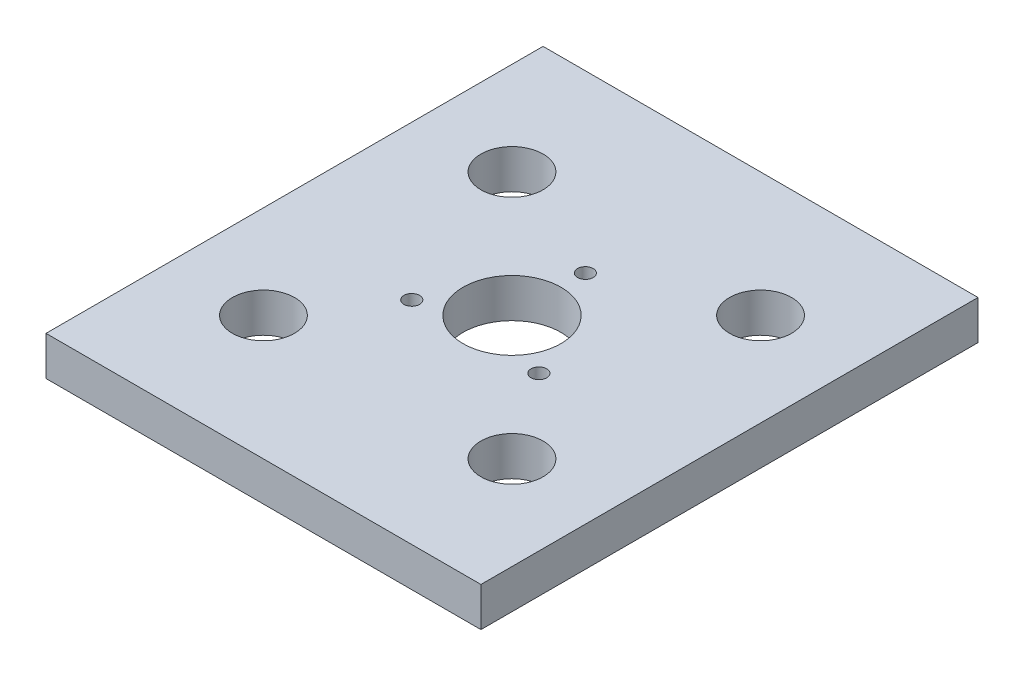
ISO-10303-21;
HEADER;
FILE_DESCRIPTION(('STEP AP214'),'2;1');
FILE_NAME('part.step','',(''),(''),'','','');
FILE_SCHEMA(('AUTOMOTIVE_DESIGN { 1 0 10303 214 1 1 1 1 }'));
ENDSEC;
DATA;
#1=APPLICATION_CONTEXT('core data for automotive mechanical design processes');
#2=APPLICATION_PROTOCOL_DEFINITION('international standard','automotive_design',2000,#1);
#3=PRODUCT_CONTEXT('',#1,'mechanical');
#4=PRODUCT('Part','Part','',(#3));
#5=PRODUCT_RELATED_PRODUCT_CATEGORY('part','',(#4));
#6=PRODUCT_DEFINITION_FORMATION('','',#4);
#7=PRODUCT_DEFINITION_CONTEXT('part definition',#1,'design');
#8=PRODUCT_DEFINITION('design','',#6,#7);
#9=PRODUCT_DEFINITION_SHAPE('','',#8);
#10=(LENGTH_UNIT() NAMED_UNIT(*) SI_UNIT(.MILLI.,.METRE.));
#11=(NAMED_UNIT(*) PLANE_ANGLE_UNIT() SI_UNIT($,.RADIAN.));
#12=(NAMED_UNIT(*) SI_UNIT($,.STERADIAN.) SOLID_ANGLE_UNIT());
#13=UNCERTAINTY_MEASURE_WITH_UNIT(LENGTH_MEASURE(1.E-05),#10,'distance_accuracy_value','');
#14=(GEOMETRIC_REPRESENTATION_CONTEXT(3) GLOBAL_UNCERTAINTY_ASSIGNED_CONTEXT((#13)) GLOBAL_UNIT_ASSIGNED_CONTEXT((#10,
#11,#12)) REPRESENTATION_CONTEXT('',''));
#15=CARTESIAN_POINT('',(0.,0.,0.));
#16=DIRECTION('',(0.,0.,1.));
#17=DIRECTION('',(1.,0.,0.));
#18=AXIS2_PLACEMENT_3D('',#15,#16,#17);
#19=CARTESIAN_POINT('',(0.,4.,25.4));
#20=DIRECTION('',(0.,0.,-1.));
#21=DIRECTION('',(-1.,0.,0.));
#22=AXIS2_PLACEMENT_3D('',#19,#20,#21);
#23=PLANE('',#22);
#24=DIRECTION('',(1.,0.,0.));
#25=VECTOR('',#24,1.);
#26=CARTESIAN_POINT('',(0.,0.,25.4));
#27=LINE('',#26,#25);
#28=CARTESIAN_POINT('',(-22.225,0.,25.4));
#29=VERTEX_POINT('',#28);
#30=CARTESIAN_POINT('',(22.225,0.,25.4));
#31=VERTEX_POINT('',#30);
#32=EDGE_CURVE('E132',#29,#31,#27,.T.);
#33=ORIENTED_EDGE('',*,*,#32,.T.);
#34=DIRECTION('',(0.,-1.,0.));
#35=VECTOR('',#34,1.);
#36=CARTESIAN_POINT('',(22.225,4.,25.4));
#37=LINE('',#36,#35);
#38=CARTESIAN_POINT('',(22.225,4.,25.4));
#39=VERTEX_POINT('',#38);
#40=EDGE_CURVE('E11',#39,#31,#37,.T.);
#41=ORIENTED_EDGE('',*,*,#40,.F.);
#42=DIRECTION('',(1.,0.,0.));
#43=VECTOR('',#42,1.);
#44=CARTESIAN_POINT('',(0.,4.,25.4));
#45=LINE('',#44,#43);
#46=CARTESIAN_POINT('',(-22.225,4.,25.4));
#47=VERTEX_POINT('',#46);
#48=EDGE_CURVE('E93',#47,#39,#45,.T.);
#49=ORIENTED_EDGE('',*,*,#48,.F.);
#50=DIRECTION('',(0.,-1.,0.));
#51=VECTOR('',#50,1.);
#52=CARTESIAN_POINT('',(-22.225,4.,25.4));
#53=LINE('',#52,#51);
#54=EDGE_CURVE('E59',#47,#29,#53,.T.);
#55=ORIENTED_EDGE('',*,*,#54,.T.);
#56=EDGE_LOOP('',(#33,#41,#49,#55));
#57=FACE_BOUND('',#56,.T.);
#58=ADVANCED_FACE('F41',(#57),#23,.F.);
#59=CARTESIAN_POINT('',(22.225,4.,0.));
#60=DIRECTION('',(-1.,0.,0.));
#61=DIRECTION('',(0.,0.,1.));
#62=AXIS2_PLACEMENT_3D('',#59,#60,#61);
#63=PLANE('',#62);
#64=DIRECTION('',(0.,0.,-1.));
#65=VECTOR('',#64,1.);
#66=CARTESIAN_POINT('',(22.225,0.,0.));
#67=LINE('',#66,#65);
#68=CARTESIAN_POINT('',(22.225,0.,-25.4));
#69=VERTEX_POINT('',#68);
#70=EDGE_CURVE('E98',#31,#69,#67,.T.);
#71=ORIENTED_EDGE('',*,*,#70,.T.);
#72=DIRECTION('',(0.,-1.,0.));
#73=VECTOR('',#72,1.);
#74=CARTESIAN_POINT('',(22.225,4.,-25.4));
#75=LINE('',#74,#73);
#76=CARTESIAN_POINT('',(22.225,4.,-25.4));
#77=VERTEX_POINT('',#76);
#78=EDGE_CURVE('E50',#77,#69,#75,.T.);
#79=ORIENTED_EDGE('',*,*,#78,.F.);
#80=DIRECTION('',(0.,0.,-1.));
#81=VECTOR('',#80,1.);
#82=CARTESIAN_POINT('',(22.225,4.,0.));
#83=LINE('',#82,#81);
#84=EDGE_CURVE('E85',#39,#77,#83,.T.);
#85=ORIENTED_EDGE('',*,*,#84,.F.);
#86=ORIENTED_EDGE('',*,*,#40,.T.);
#87=EDGE_LOOP('',(#71,#79,#85,#86));
#88=FACE_BOUND('',#87,.T.);
#89=ADVANCED_FACE('F97',(#88),#63,.F.);
#90=CARTESIAN_POINT('',(0.,4.,-25.4));
#91=DIRECTION('',(0.,0.,1.));
#92=DIRECTION('',(1.,0.,0.));
#93=AXIS2_PLACEMENT_3D('',#90,#91,#92);
#94=PLANE('',#93);
#95=DIRECTION('',(-1.,0.,0.));
#96=VECTOR('',#95,1.);
#97=CARTESIAN_POINT('',(0.,0.,-25.4));
#98=LINE('',#97,#96);
#99=CARTESIAN_POINT('',(-22.225,0.,-25.4));
#100=VERTEX_POINT('',#99);
#101=EDGE_CURVE('E135',#69,#100,#98,.T.);
#102=ORIENTED_EDGE('',*,*,#101,.T.);
#103=DIRECTION('',(0.,-1.,0.));
#104=VECTOR('',#103,1.);
#105=CARTESIAN_POINT('',(-22.225,4.,-25.4));
#106=LINE('',#105,#104);
#107=CARTESIAN_POINT('',(-22.225,4.,-25.4));
#108=VERTEX_POINT('',#107);
#109=EDGE_CURVE('E74',#108,#100,#106,.T.);
#110=ORIENTED_EDGE('',*,*,#109,.F.);
#111=DIRECTION('',(-1.,0.,0.));
#112=VECTOR('',#111,1.);
#113=CARTESIAN_POINT('',(0.,4.,-25.4));
#114=LINE('',#113,#112);
#115=EDGE_CURVE('E92',#77,#108,#114,.T.);
#116=ORIENTED_EDGE('',*,*,#115,.F.);
#117=ORIENTED_EDGE('',*,*,#78,.T.);
#118=EDGE_LOOP('',(#102,#110,#116,#117));
#119=FACE_BOUND('',#118,.T.);
#120=ADVANCED_FACE('F102',(#119),#94,.F.);
#121=CARTESIAN_POINT('',(12.7,4.,12.7));
#122=DIRECTION('',(0.,-1.,0.));
#123=DIRECTION('',(0.,0.,-1.));
#124=AXIS2_PLACEMENT_3D('',#121,#122,#123);
#125=CYLINDRICAL_SURFACE('',#124,3.175);
#126=CARTESIAN_POINT('',(12.7,4.,12.7));
#127=DIRECTION('',(0.,1.,0.));
#128=DIRECTION('',(0.,0.,1.));
#129=AXIS2_PLACEMENT_3D('',#126,#127,#128);
#130=CIRCLE('',#129,3.175);
#131=CARTESIAN_POINT('',(12.7,4.,15.875));
#132=VERTEX_POINT('',#131);
#133=EDGE_CURVE('E126',#132,#132,#130,.T.);
#134=ORIENTED_EDGE('',*,*,#133,.T.);
#135=EDGE_LOOP('',(#134));
#136=FACE_BOUND('',#135,.T.);
#137=CARTESIAN_POINT('',(12.7,0.,12.7));
#138=DIRECTION('',(0.,1.,0.));
#139=DIRECTION('',(0.,0.,1.));
#140=AXIS2_PLACEMENT_3D('',#137,#138,#139);
#141=CIRCLE('',#140,3.175);
#142=CARTESIAN_POINT('',(12.7,0.,15.875));
#143=VERTEX_POINT('',#142);
#144=EDGE_CURVE('E149',#143,#143,#141,.T.);
#145=ORIENTED_EDGE('',*,*,#144,.F.);
#146=EDGE_LOOP('',(#145));
#147=FACE_BOUND('',#146,.T.);
#148=ADVANCED_FACE('F174',(#136,#147),#125,.F.);
#149=CARTESIAN_POINT('',(0.,4.,-7.5));
#150=DIRECTION('',(0.,-1.,0.));
#151=DIRECTION('',(0.,0.,-1.));
#152=AXIS2_PLACEMENT_3D('',#149,#150,#151);
#153=CYLINDRICAL_SURFACE('',#152,0.8);
#154=CARTESIAN_POINT('',(0.,2.,-7.5));
#155=DIRECTION('',(0.,1.,0.));
#156=DIRECTION('',(0.,0.,1.));
#157=AXIS2_PLACEMENT_3D('',#154,#155,#156);
#158=CIRCLE('',#157,0.8);
#159=CARTESIAN_POINT('',(0.,2.,-6.7));
#160=VERTEX_POINT('',#159);
#161=EDGE_CURVE('E44',#160,#160,#158,.T.);
#162=ORIENTED_EDGE('',*,*,#161,.F.);
#163=EDGE_LOOP('',(#162));
#164=FACE_BOUND('',#163,.T.);
#165=CARTESIAN_POINT('',(0.,4.,-7.5));
#166=DIRECTION('',(0.,1.,0.));
#167=DIRECTION('',(0.,0.,1.));
#168=AXIS2_PLACEMENT_3D('',#165,#166,#167);
#169=CIRCLE('',#168,0.8);
#170=CARTESIAN_POINT('',(0.,4.,-6.7));
#171=VERTEX_POINT('',#170);
#172=EDGE_CURVE('E123',#171,#171,#169,.T.);
#173=ORIENTED_EDGE('',*,*,#172,.T.);
#174=EDGE_LOOP('',(#173));
#175=FACE_BOUND('',#174,.T.);
#176=ADVANCED_FACE('F170',(#164,#175),#153,.F.);
#177=CARTESIAN_POINT('',(6.49519052838329,4.,3.75));
#178=DIRECTION('',(0.,-1.,0.));
#179=DIRECTION('',(0.,0.,-1.));
#180=AXIS2_PLACEMENT_3D('',#177,#178,#179);
#181=CYLINDRICAL_SURFACE('',#180,0.800000000000001);
#182=CARTESIAN_POINT('',(6.49519052838329,2.,3.75));
#183=DIRECTION('',(0.,1.,0.));
#184=DIRECTION('',(0.,0.,1.));
#185=AXIS2_PLACEMENT_3D('',#182,#183,#184);
#186=CIRCLE('',#185,0.800000000000001);
#187=CARTESIAN_POINT('',(6.49519052838329,2.,4.55));
#188=VERTEX_POINT('',#187);
#189=EDGE_CURVE('E159',#188,#188,#186,.T.);
#190=ORIENTED_EDGE('',*,*,#189,.F.);
#191=EDGE_LOOP('',(#190));
#192=FACE_BOUND('',#191,.T.);
#193=CARTESIAN_POINT('',(6.49519052838329,4.,3.75));
#194=DIRECTION('',(0.,1.,0.));
#195=DIRECTION('',(0.,0.,1.));
#196=AXIS2_PLACEMENT_3D('',#193,#194,#195);
#197=CIRCLE('',#196,0.800000000000001);
#198=CARTESIAN_POINT('',(6.49519052838329,4.,4.55));
#199=VERTEX_POINT('',#198);
#200=EDGE_CURVE('E120',#199,#199,#197,.T.);
#201=ORIENTED_EDGE('',*,*,#200,.T.);
#202=EDGE_LOOP('',(#201));
#203=FACE_BOUND('',#202,.T.);
#204=ADVANCED_FACE('F173',(#192,#203),#181,.F.);
#205=CARTESIAN_POINT('',(-6.49519052838329,4.,3.75));
#206=DIRECTION('',(0.,-1.,0.));
#207=DIRECTION('',(0.,0.,-1.));
#208=AXIS2_PLACEMENT_3D('',#205,#206,#207);
#209=CYLINDRICAL_SURFACE('',#208,0.800000000000001);
#210=CARTESIAN_POINT('',(-6.49519052838329,2.,3.75));
#211=DIRECTION('',(0.,1.,0.));
#212=DIRECTION('',(0.,0.,1.));
#213=AXIS2_PLACEMENT_3D('',#210,#211,#212);
#214=CIRCLE('',#213,0.800000000000001);
#215=CARTESIAN_POINT('',(-6.49519052838329,2.,4.55));
#216=VERTEX_POINT('',#215);
#217=EDGE_CURVE('E157',#216,#216,#214,.T.);
#218=ORIENTED_EDGE('',*,*,#217,.F.);
#219=EDGE_LOOP('',(#218));
#220=FACE_BOUND('',#219,.T.);
#221=CARTESIAN_POINT('',(-6.49519052838329,4.,3.75));
#222=DIRECTION('',(0.,1.,0.));
#223=DIRECTION('',(0.,0.,1.));
#224=AXIS2_PLACEMENT_3D('',#221,#222,#223);
#225=CIRCLE('',#224,0.800000000000001);
#226=CARTESIAN_POINT('',(-6.49519052838329,4.,4.55));
#227=VERTEX_POINT('',#226);
#228=EDGE_CURVE('E117',#227,#227,#225,.T.);
#229=ORIENTED_EDGE('',*,*,#228,.T.);
#230=EDGE_LOOP('',(#229));
#231=FACE_BOUND('',#230,.T.);
#232=ADVANCED_FACE('F235',(#220,#231),#209,.F.);
#233=CARTESIAN_POINT('',(0.,4.,0.));
#234=DIRECTION('',(0.,-1.,0.));
#235=DIRECTION('',(0.,0.,-1.));
#236=AXIS2_PLACEMENT_3D('',#233,#234,#235);
#237=CYLINDRICAL_SURFACE('',#236,5.);
#238=CARTESIAN_POINT('',(0.,4.,0.));
#239=DIRECTION('',(0.,1.,0.));
#240=DIRECTION('',(0.,0.,1.));
#241=AXIS2_PLACEMENT_3D('',#238,#239,#240);
#242=CIRCLE('',#241,5.);
#243=CARTESIAN_POINT('',(0.,4.,5.));
#244=VERTEX_POINT('',#243);
#245=EDGE_CURVE('E114',#244,#244,#242,.T.);
#246=ORIENTED_EDGE('',*,*,#245,.T.);
#247=EDGE_LOOP('',(#246));
#248=FACE_BOUND('',#247,.T.);
#249=CARTESIAN_POINT('',(0.,0.,0.));
#250=DIRECTION('',(0.,1.,0.));
#251=DIRECTION('',(0.,0.,1.));
#252=AXIS2_PLACEMENT_3D('',#249,#250,#251);
#253=CIRCLE('',#252,5.);
#254=CARTESIAN_POINT('',(0.,0.,5.));
#255=VERTEX_POINT('',#254);
#256=EDGE_CURVE('E146',#255,#255,#253,.T.);
#257=ORIENTED_EDGE('',*,*,#256,.F.);
#258=EDGE_LOOP('',(#257));
#259=FACE_BOUND('',#258,.T.);
#260=ADVANCED_FACE('F238',(#248,#259),#237,.F.);
#261=CARTESIAN_POINT('',(-12.7,4.,-12.7));
#262=DIRECTION('',(0.,-1.,0.));
#263=DIRECTION('',(0.,0.,-1.));
#264=AXIS2_PLACEMENT_3D('',#261,#262,#263);
#265=CYLINDRICAL_SURFACE('',#264,3.175);
#266=CARTESIAN_POINT('',(-12.7,4.,-12.7));
#267=DIRECTION('',(0.,1.,0.));
#268=DIRECTION('',(0.,0.,1.));
#269=AXIS2_PLACEMENT_3D('',#266,#267,#268);
#270=CIRCLE('',#269,3.175);
#271=CARTESIAN_POINT('',(-12.7,4.,-9.525));
#272=VERTEX_POINT('',#271);
#273=EDGE_CURVE('E111',#272,#272,#270,.T.);
#274=ORIENTED_EDGE('',*,*,#273,.T.);
#275=EDGE_LOOP('',(#274));
#276=FACE_BOUND('',#275,.T.);
#277=CARTESIAN_POINT('',(-12.7,0.,-12.7));
#278=DIRECTION('',(0.,1.,0.));
#279=DIRECTION('',(0.,0.,1.));
#280=AXIS2_PLACEMENT_3D('',#277,#278,#279);
#281=CIRCLE('',#280,3.175);
#282=CARTESIAN_POINT('',(-12.7,0.,-9.525));
#283=VERTEX_POINT('',#282);
#284=EDGE_CURVE('E143',#283,#283,#281,.T.);
#285=ORIENTED_EDGE('',*,*,#284,.F.);
#286=EDGE_LOOP('',(#285));
#287=FACE_BOUND('',#286,.T.);
#288=ADVANCED_FACE('F217',(#276,#287),#265,.F.);
#289=CARTESIAN_POINT('',(-12.7,4.,12.7));
#290=DIRECTION('',(0.,-1.,0.));
#291=DIRECTION('',(0.,0.,-1.));
#292=AXIS2_PLACEMENT_3D('',#289,#290,#291);
#293=CYLINDRICAL_SURFACE('',#292,3.175);
#294=CARTESIAN_POINT('',(-12.7,4.,12.7));
#295=DIRECTION('',(0.,1.,0.));
#296=DIRECTION('',(0.,0.,1.));
#297=AXIS2_PLACEMENT_3D('',#294,#295,#296);
#298=CIRCLE('',#297,3.175);
#299=CARTESIAN_POINT('',(-12.7,4.,15.875));
#300=VERTEX_POINT('',#299);
#301=EDGE_CURVE('E105',#300,#300,#298,.F.);
#302=ORIENTED_EDGE('',*,*,#301,.F.);
#303=EDGE_LOOP('',(#302));
#304=FACE_BOUND('',#303,.T.);
#305=CARTESIAN_POINT('',(-12.7,0.,12.7));
#306=DIRECTION('',(0.,1.,0.));
#307=DIRECTION('',(0.,0.,1.));
#308=AXIS2_PLACEMENT_3D('',#305,#306,#307);
#309=CIRCLE('',#308,3.175);
#310=CARTESIAN_POINT('',(-12.7,0.,15.875));
#311=VERTEX_POINT('',#310);
#312=EDGE_CURVE('E140',#311,#311,#309,.F.);
#313=ORIENTED_EDGE('',*,*,#312,.T.);
#314=EDGE_LOOP('',(#313));
#315=FACE_BOUND('',#314,.T.);
#316=ADVANCED_FACE('F212',(#304,#315),#293,.F.);
#317=CARTESIAN_POINT('',(-22.225,4.,0.));
#318=DIRECTION('',(-1.,0.,0.));
#319=DIRECTION('',(0.,0.,1.));
#320=AXIS2_PLACEMENT_3D('',#317,#318,#319);
#321=PLANE('',#320);
#322=DIRECTION('',(0.,0.,-1.));
#323=VECTOR('',#322,1.);
#324=CARTESIAN_POINT('',(-22.225,0.,0.));
#325=LINE('',#324,#323);
#326=EDGE_CURVE('E137',#29,#100,#325,.T.);
#327=ORIENTED_EDGE('',*,*,#326,.F.);
#328=ORIENTED_EDGE('',*,*,#54,.F.);
#329=DIRECTION('',(0.,0.,-1.));
#330=VECTOR('',#329,1.);
#331=CARTESIAN_POINT('',(-22.225,4.,0.));
#332=LINE('',#331,#330);
#333=EDGE_CURVE('E103',#47,#108,#332,.T.);
#334=ORIENTED_EDGE('',*,*,#333,.T.);
#335=ORIENTED_EDGE('',*,*,#109,.T.);
#336=EDGE_LOOP('',(#327,#328,#334,#335));
#337=FACE_BOUND('',#336,.T.);
#338=ADVANCED_FACE('F189',(#337),#321,.T.);
#339=CARTESIAN_POINT('',(12.7,4.,-12.7));
#340=DIRECTION('',(0.,-1.,0.));
#341=DIRECTION('',(0.,0.,-1.));
#342=AXIS2_PLACEMENT_3D('',#339,#340,#341);
#343=CYLINDRICAL_SURFACE('',#342,3.175);
#344=CARTESIAN_POINT('',(12.7,4.,-12.7));
#345=DIRECTION('',(0.,1.,0.));
#346=DIRECTION('',(0.,0.,1.));
#347=AXIS2_PLACEMENT_3D('',#344,#345,#346);
#348=CIRCLE('',#347,3.175);
#349=CARTESIAN_POINT('',(12.7,4.,-9.525));
#350=VERTEX_POINT('',#349);
#351=EDGE_CURVE('E129',#350,#350,#348,.F.);
#352=ORIENTED_EDGE('',*,*,#351,.F.);
#353=EDGE_LOOP('',(#352));
#354=FACE_BOUND('',#353,.T.);
#355=CARTESIAN_POINT('',(12.7,0.,-12.7));
#356=DIRECTION('',(0.,1.,0.));
#357=DIRECTION('',(0.,0.,1.));
#358=AXIS2_PLACEMENT_3D('',#355,#356,#357);
#359=CIRCLE('',#358,3.175);
#360=CARTESIAN_POINT('',(12.7,0.,-9.525));
#361=VERTEX_POINT('',#360);
#362=EDGE_CURVE('E152',#361,#361,#359,.F.);
#363=ORIENTED_EDGE('',*,*,#362,.T.);
#364=EDGE_LOOP('',(#363));
#365=FACE_BOUND('',#364,.T.);
#366=ADVANCED_FACE('F181',(#354,#365),#343,.F.);
#367=CARTESIAN_POINT('',(0.,4.,0.));
#368=DIRECTION('',(0.,1.,0.));
#369=DIRECTION('',(0.,0.,1.));
#370=AXIS2_PLACEMENT_3D('',#367,#368,#369);
#371=PLANE('',#370);
#372=ORIENTED_EDGE('',*,*,#48,.T.);
#373=ORIENTED_EDGE('',*,*,#84,.T.);
#374=ORIENTED_EDGE('',*,*,#115,.T.);
#375=ORIENTED_EDGE('',*,*,#333,.F.);
#376=EDGE_LOOP('',(#372,#373,#374,#375));
#377=FACE_BOUND('',#376,.T.);
#378=ORIENTED_EDGE('',*,*,#301,.T.);
#379=EDGE_LOOP('',(#378));
#380=FACE_BOUND('',#379,.T.);
#381=ORIENTED_EDGE('',*,*,#273,.F.);
#382=EDGE_LOOP('',(#381));
#383=FACE_BOUND('',#382,.T.);
#384=ORIENTED_EDGE('',*,*,#245,.F.);
#385=EDGE_LOOP('',(#384));
#386=FACE_BOUND('',#385,.T.);
#387=ORIENTED_EDGE('',*,*,#228,.F.);
#388=EDGE_LOOP('',(#387));
#389=FACE_BOUND('',#388,.T.);
#390=ORIENTED_EDGE('',*,*,#200,.F.);
#391=EDGE_LOOP('',(#390));
#392=FACE_BOUND('',#391,.T.);
#393=ORIENTED_EDGE('',*,*,#172,.F.);
#394=EDGE_LOOP('',(#393));
#395=FACE_BOUND('',#394,.T.);
#396=ORIENTED_EDGE('',*,*,#133,.F.);
#397=EDGE_LOOP('',(#396));
#398=FACE_BOUND('',#397,.T.);
#399=ORIENTED_EDGE('',*,*,#351,.T.);
#400=EDGE_LOOP('',(#399));
#401=FACE_BOUND('',#400,.T.);
#402=ADVANCED_FACE('F88',(#377,#380,#383,#386,#389,#392,#395,#398,#401),#371,.T.);
#403=CARTESIAN_POINT('',(0.,0.,0.));
#404=DIRECTION('',(0.,1.,0.));
#405=DIRECTION('',(0.,0.,1.));
#406=AXIS2_PLACEMENT_3D('',#403,#404,#405);
#407=PLANE('',#406);
#408=CARTESIAN_POINT('',(6.49519052838329,0.,3.75));
#409=DIRECTION('',(0.,1.,0.));
#410=DIRECTION('',(0.,0.,1.));
#411=AXIS2_PLACEMENT_3D('',#408,#409,#410);
#412=CIRCLE('',#411,1.6);
#413=CARTESIAN_POINT('',(6.49519052838329,0.,5.35));
#414=VERTEX_POINT('',#413);
#415=EDGE_CURVE('E362',#414,#414,#412,.T.);
#416=ORIENTED_EDGE('',*,*,#415,.T.);
#417=EDGE_LOOP('',(#416));
#418=FACE_BOUND('',#417,.T.);
#419=CARTESIAN_POINT('',(-6.49519052838331,0.,3.74999999999997));
#420=DIRECTION('',(0.,1.,0.));
#421=DIRECTION('',(0.,0.,1.));
#422=AXIS2_PLACEMENT_3D('',#419,#420,#421);
#423=CIRCLE('',#422,1.6);
#424=CARTESIAN_POINT('',(-6.49519052838331,0.,5.34999999999997));
#425=VERTEX_POINT('',#424);
#426=EDGE_CURVE('E364',#425,#425,#423,.T.);
#427=ORIENTED_EDGE('',*,*,#426,.T.);
#428=EDGE_LOOP('',(#427));
#429=FACE_BOUND('',#428,.T.);
#430=CARTESIAN_POINT('',(0.,0.,-7.5));
#431=DIRECTION('',(0.,1.,0.));
#432=DIRECTION('',(0.,0.,1.));
#433=AXIS2_PLACEMENT_3D('',#430,#431,#432);
#434=CIRCLE('',#433,1.6);
#435=CARTESIAN_POINT('',(0.,0.,-5.9));
#436=VERTEX_POINT('',#435);
#437=EDGE_CURVE('E372',#436,#436,#434,.T.);
#438=ORIENTED_EDGE('',*,*,#437,.T.);
#439=EDGE_LOOP('',(#438));
#440=FACE_BOUND('',#439,.T.);
#441=ORIENTED_EDGE('',*,*,#32,.F.);
#442=ORIENTED_EDGE('',*,*,#326,.T.);
#443=ORIENTED_EDGE('',*,*,#101,.F.);
#444=ORIENTED_EDGE('',*,*,#70,.F.);
#445=EDGE_LOOP('',(#441,#442,#443,#444));
#446=FACE_BOUND('',#445,.T.);
#447=ORIENTED_EDGE('',*,*,#312,.F.);
#448=EDGE_LOOP('',(#447));
#449=FACE_BOUND('',#448,.T.);
#450=ORIENTED_EDGE('',*,*,#284,.T.);
#451=EDGE_LOOP('',(#450));
#452=FACE_BOUND('',#451,.T.);
#453=ORIENTED_EDGE('',*,*,#256,.T.);
#454=EDGE_LOOP('',(#453));
#455=FACE_BOUND('',#454,.T.);
#456=ORIENTED_EDGE('',*,*,#144,.T.);
#457=EDGE_LOOP('',(#456));
#458=FACE_BOUND('',#457,.T.);
#459=ORIENTED_EDGE('',*,*,#362,.F.);
#460=EDGE_LOOP('',(#459));
#461=FACE_BOUND('',#460,.T.);
#462=ADVANCED_FACE('F180',(#418,#429,#440,#446,#449,#452,#455,#458,#461),#407,.F.);
#463=CARTESIAN_POINT('',(0.,2.,-7.5));
#464=DIRECTION('',(0.,-1.,0.));
#465=DIRECTION('',(0.,0.,-1.));
#466=AXIS2_PLACEMENT_3D('',#463,#464,#465);
#467=CYLINDRICAL_SURFACE('',#466,1.6);
#468=CARTESIAN_POINT('',(0.,2.,-7.5));
#469=DIRECTION('',(0.,1.,0.));
#470=DIRECTION('',(0.,0.,1.));
#471=AXIS2_PLACEMENT_3D('',#468,#469,#470);
#472=CIRCLE('',#471,1.6);
#473=CARTESIAN_POINT('',(0.,2.,-5.9));
#474=VERTEX_POINT('',#473);
#475=EDGE_CURVE('E375',#474,#474,#472,.T.);
#476=ORIENTED_EDGE('',*,*,#475,.T.);
#477=EDGE_LOOP('',(#476));
#478=FACE_BOUND('',#477,.T.);
#479=ORIENTED_EDGE('',*,*,#437,.F.);
#480=EDGE_LOOP('',(#479));
#481=FACE_BOUND('',#480,.T.);
#482=ADVANCED_FACE('F194',(#478,#481),#467,.F.);
#483=CARTESIAN_POINT('',(0.,2.,-7.5));
#484=DIRECTION('',(0.,1.,0.));
#485=DIRECTION('',(0.,0.,1.));
#486=AXIS2_PLACEMENT_3D('',#483,#484,#485);
#487=PLANE('',#486);
#488=ORIENTED_EDGE('',*,*,#161,.T.);
#489=EDGE_LOOP('',(#488));
#490=FACE_BOUND('',#489,.T.);
#491=ORIENTED_EDGE('',*,*,#475,.F.);
#492=EDGE_LOOP('',(#491));
#493=FACE_BOUND('',#492,.T.);
#494=ADVANCED_FACE('F167',(#490,#493),#487,.F.);
#495=CARTESIAN_POINT('',(-6.49519052838331,2.,3.74999999999997));
#496=DIRECTION('',(0.,-1.,0.));
#497=DIRECTION('',(0.,0.,-1.));
#498=AXIS2_PLACEMENT_3D('',#495,#496,#497);
#499=CYLINDRICAL_SURFACE('',#498,1.6);
#500=CARTESIAN_POINT('',(-6.49519052838331,2.,3.74999999999997));
#501=DIRECTION('',(0.,1.,0.));
#502=DIRECTION('',(0.,0.,1.));
#503=AXIS2_PLACEMENT_3D('',#500,#501,#502);
#504=CIRCLE('',#503,1.6);
#505=CARTESIAN_POINT('',(-6.49519052838331,2.,5.34999999999997));
#506=VERTEX_POINT('',#505);
#507=EDGE_CURVE('E369',#506,#506,#504,.T.);
#508=ORIENTED_EDGE('',*,*,#507,.T.);
#509=EDGE_LOOP('',(#508));
#510=FACE_BOUND('',#509,.T.);
#511=ORIENTED_EDGE('',*,*,#426,.F.);
#512=EDGE_LOOP('',(#511));
#513=FACE_BOUND('',#512,.T.);
#514=ADVANCED_FACE('F318',(#510,#513),#499,.F.);
#515=CARTESIAN_POINT('',(-6.49519052838331,2.,3.74999999999997));
#516=DIRECTION('',(0.,1.,0.));
#517=DIRECTION('',(0.,0.,1.));
#518=AXIS2_PLACEMENT_3D('',#515,#516,#517);
#519=PLANE('',#518);
#520=ORIENTED_EDGE('',*,*,#217,.T.);
#521=EDGE_LOOP('',(#520));
#522=FACE_BOUND('',#521,.T.);
#523=ORIENTED_EDGE('',*,*,#507,.F.);
#524=EDGE_LOOP('',(#523));
#525=FACE_BOUND('',#524,.T.);
#526=ADVANCED_FACE('F327',(#522,#525),#519,.F.);
#527=CARTESIAN_POINT('',(6.49519052838329,2.,3.75));
#528=DIRECTION('',(0.,-1.,0.));
#529=DIRECTION('',(0.,0.,-1.));
#530=AXIS2_PLACEMENT_3D('',#527,#528,#529);
#531=CYLINDRICAL_SURFACE('',#530,1.6);
#532=CARTESIAN_POINT('',(6.49519052838329,2.,3.75));
#533=DIRECTION('',(0.,1.,0.));
#534=DIRECTION('',(0.,0.,1.));
#535=AXIS2_PLACEMENT_3D('',#532,#533,#534);
#536=CIRCLE('',#535,1.6);
#537=CARTESIAN_POINT('',(6.49519052838329,2.,5.35));
#538=VERTEX_POINT('',#537);
#539=EDGE_CURVE('E160',#538,#538,#536,.T.);
#540=ORIENTED_EDGE('',*,*,#539,.T.);
#541=EDGE_LOOP('',(#540));
#542=FACE_BOUND('',#541,.T.);
#543=ORIENTED_EDGE('',*,*,#415,.F.);
#544=EDGE_LOOP('',(#543));
#545=FACE_BOUND('',#544,.T.);
#546=ADVANCED_FACE('F337',(#542,#545),#531,.F.);
#547=CARTESIAN_POINT('',(6.49519052838329,2.,3.75));
#548=DIRECTION('',(0.,1.,0.));
#549=DIRECTION('',(0.,0.,1.));
#550=AXIS2_PLACEMENT_3D('',#547,#548,#549);
#551=PLANE('',#550);
#552=ORIENTED_EDGE('',*,*,#189,.T.);
#553=EDGE_LOOP('',(#552));
#554=FACE_BOUND('',#553,.T.);
#555=ORIENTED_EDGE('',*,*,#539,.F.);
#556=EDGE_LOOP('',(#555));
#557=FACE_BOUND('',#556,.T.);
#558=ADVANCED_FACE('F347',(#554,#557),#551,.F.);
#559=CLOSED_SHELL('',(#58,#89,#120,#148,#176,#204,#232,#260,#288,#316,#338,#366,#402,#462,#482,
#494,#514,#526,#546,#558));
#560=MANIFOLD_SOLID_BREP('B2',#559);
#561=ADVANCED_BREP_SHAPE_REPRESENTATION('',(#18,#560),#14);
#562=SHAPE_DEFINITION_REPRESENTATION(#9,#561);
ENDSEC;
END-ISO-10303-21;
